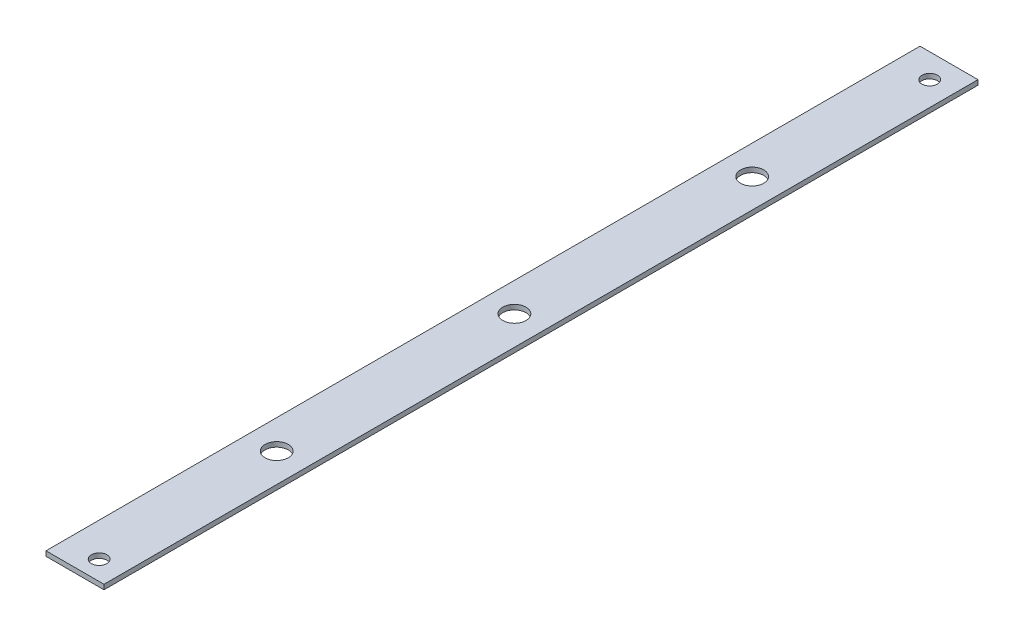
ISO-10303-21;
HEADER;
FILE_DESCRIPTION(('STEP AP214'),'2;1');
FILE_NAME('part.step','',(''),(''),'','','');
FILE_SCHEMA(('AUTOMOTIVE_DESIGN { 1 0 10303 214 1 1 1 1 }'));
ENDSEC;
DATA;
#1=APPLICATION_CONTEXT('core data for automotive mechanical design processes');
#2=APPLICATION_PROTOCOL_DEFINITION('international standard','automotive_design',2000,#1);
#3=PRODUCT_CONTEXT('',#1,'mechanical');
#4=PRODUCT('Part','Part','',(#3));
#5=PRODUCT_RELATED_PRODUCT_CATEGORY('part','',(#4));
#6=PRODUCT_DEFINITION_FORMATION('','',#4);
#7=PRODUCT_DEFINITION_CONTEXT('part definition',#1,'design');
#8=PRODUCT_DEFINITION('design','',#6,#7);
#9=PRODUCT_DEFINITION_SHAPE('','',#8);
#10=(LENGTH_UNIT() NAMED_UNIT(*) SI_UNIT(.MILLI.,.METRE.));
#11=(NAMED_UNIT(*) PLANE_ANGLE_UNIT() SI_UNIT($,.RADIAN.));
#12=(NAMED_UNIT(*) SI_UNIT($,.STERADIAN.) SOLID_ANGLE_UNIT());
#13=UNCERTAINTY_MEASURE_WITH_UNIT(LENGTH_MEASURE(1.E-05),#10,'distance_accuracy_value','');
#14=(GEOMETRIC_REPRESENTATION_CONTEXT(3) GLOBAL_UNCERTAINTY_ASSIGNED_CONTEXT((#13)) GLOBAL_UNIT_ASSIGNED_CONTEXT((#10,
#11,#12)) REPRESENTATION_CONTEXT('',''));
#15=CARTESIAN_POINT('',(0.,0.,0.));
#16=DIRECTION('',(0.,0.,1.));
#17=DIRECTION('',(1.,0.,0.));
#18=AXIS2_PLACEMENT_3D('',#15,#16,#17);
#19=CARTESIAN_POINT('',(30.,0.,226.1));
#20=DIRECTION('',(0.,1.,0.));
#21=DIRECTION('',(-1.,0.,0.));
#22=AXIS2_PLACEMENT_3D('',#19,#20,#21);
#23=PLANE('',#22);
#24=CARTESIAN_POINT('',(15.,0.,121.75));
#25=DIRECTION('',(0.,1.,0.));
#26=DIRECTION('',(-1.,0.,0.));
#27=AXIS2_PLACEMENT_3D('',#24,#25,#26);
#28=CIRCLE('',#27,6.00000000000001);
#29=CARTESIAN_POINT('',(8.99999999999999,0.,121.75));
#30=VERTEX_POINT('',#29);
#31=EDGE_CURVE('E131',#30,#30,#28,.T.);
#32=ORIENTED_EDGE('',*,*,#31,.T.);
#33=EDGE_LOOP('',(#32));
#34=FACE_BOUND('',#33,.T.);
#35=CARTESIAN_POINT('',(17.5,0.,216.1));
#36=DIRECTION('',(0.,1.,0.));
#37=DIRECTION('',(1.,0.,0.));
#38=AXIS2_PLACEMENT_3D('',#35,#36,#37);
#39=CIRCLE('',#38,4.);
#40=CARTESIAN_POINT('',(21.5,0.,216.1));
#41=VERTEX_POINT('',#40);
#42=EDGE_CURVE('E125',#41,#41,#39,.T.);
#43=ORIENTED_EDGE('',*,*,#42,.T.);
#44=EDGE_LOOP('',(#43));
#45=FACE_BOUND('',#44,.T.);
#46=CARTESIAN_POINT('',(17.5,0.,-213.6));
#47=DIRECTION('',(0.,1.,0.));
#48=DIRECTION('',(-1.,0.,0.));
#49=AXIS2_PLACEMENT_3D('',#46,#47,#48);
#50=CIRCLE('',#49,4.);
#51=CARTESIAN_POINT('',(13.5,0.,-213.6));
#52=VERTEX_POINT('',#51);
#53=EDGE_CURVE('E119',#52,#52,#50,.T.);
#54=ORIENTED_EDGE('',*,*,#53,.T.);
#55=EDGE_LOOP('',(#54));
#56=FACE_BOUND('',#55,.T.);
#57=CARTESIAN_POINT('',(15.,0.,-124.25));
#58=DIRECTION('',(0.,1.,0.));
#59=DIRECTION('',(-1.,0.,0.));
#60=AXIS2_PLACEMENT_3D('',#57,#58,#59);
#61=CIRCLE('',#60,6.);
#62=CARTESIAN_POINT('',(9.,0.,-124.25));
#63=VERTEX_POINT('',#62);
#64=EDGE_CURVE('E113',#63,#63,#61,.T.);
#65=ORIENTED_EDGE('',*,*,#64,.T.);
#66=EDGE_LOOP('',(#65));
#67=FACE_BOUND('',#66,.T.);
#68=CARTESIAN_POINT('',(15.,0.,-1.25));
#69=DIRECTION('',(0.,1.,0.));
#70=DIRECTION('',(-1.,0.,0.));
#71=AXIS2_PLACEMENT_3D('',#68,#69,#70);
#72=CIRCLE('',#71,6.);
#73=CARTESIAN_POINT('',(9.,0.,-1.25));
#74=VERTEX_POINT('',#73);
#75=EDGE_CURVE('E99',#74,#74,#72,.T.);
#76=ORIENTED_EDGE('',*,*,#75,.T.);
#77=EDGE_LOOP('',(#76));
#78=FACE_BOUND('',#77,.T.);
#79=DIRECTION('',(1.,0.,0.));
#80=VECTOR('',#79,1.);
#81=CARTESIAN_POINT('',(30.,0.,-226.1));
#82=LINE('',#81,#80);
#83=CARTESIAN_POINT('',(0.,0.,-226.1));
#84=VERTEX_POINT('',#83);
#85=CARTESIAN_POINT('',(30.,0.,-226.1));
#86=VERTEX_POINT('',#85);
#87=EDGE_CURVE('E96',#84,#86,#82,.T.);
#88=ORIENTED_EDGE('',*,*,#87,.T.);
#89=DIRECTION('',(0.,0.,-1.));
#90=VECTOR('',#89,1.);
#91=CARTESIAN_POINT('',(30.,0.,226.1));
#92=LINE('',#91,#90);
#93=CARTESIAN_POINT('',(30.,0.,226.1));
#94=VERTEX_POINT('',#93);
#95=EDGE_CURVE('E11',#94,#86,#92,.T.);
#96=ORIENTED_EDGE('',*,*,#95,.F.);
#97=DIRECTION('',(1.,0.,0.));
#98=VECTOR('',#97,1.);
#99=CARTESIAN_POINT('',(30.,0.,226.1));
#100=LINE('',#99,#98);
#101=CARTESIAN_POINT('',(0.,0.,226.1));
#102=VERTEX_POINT('',#101);
#103=EDGE_CURVE('E83',#102,#94,#100,.T.);
#104=ORIENTED_EDGE('',*,*,#103,.F.);
#105=DIRECTION('',(0.,0.,-1.));
#106=VECTOR('',#105,1.);
#107=CARTESIAN_POINT('',(0.,0.,226.1));
#108=LINE('',#107,#106);
#109=EDGE_CURVE('E92',#102,#84,#108,.T.);
#110=ORIENTED_EDGE('',*,*,#109,.T.);
#111=EDGE_LOOP('',(#88,#96,#104,#110));
#112=FACE_BOUND('',#111,.T.);
#113=ADVANCED_FACE('F33',(#34,#45,#56,#67,#78,#112),#23,.F.);
#114=CARTESIAN_POINT('',(30.,2.5,226.1));
#115=DIRECTION('',(-1.,0.,0.));
#116=DIRECTION('',(0.,0.,1.));
#117=AXIS2_PLACEMENT_3D('',#114,#115,#116);
#118=PLANE('',#117);
#119=DIRECTION('',(0.,1.,0.));
#120=VECTOR('',#119,1.);
#121=CARTESIAN_POINT('',(30.,2.5,-226.1));
#122=LINE('',#121,#120);
#123=CARTESIAN_POINT('',(30.,2.5,-226.1));
#124=VERTEX_POINT('',#123);
#125=EDGE_CURVE('E88',#86,#124,#122,.T.);
#126=ORIENTED_EDGE('',*,*,#125,.T.);
#127=DIRECTION('',(0.,0.,-1.));
#128=VECTOR('',#127,1.);
#129=CARTESIAN_POINT('',(30.,2.5,226.1));
#130=LINE('',#129,#128);
#131=CARTESIAN_POINT('',(30.,2.5,226.1));
#132=VERTEX_POINT('',#131);
#133=EDGE_CURVE('E41',#132,#124,#130,.T.);
#134=ORIENTED_EDGE('',*,*,#133,.F.);
#135=DIRECTION('',(0.,1.,0.));
#136=VECTOR('',#135,1.);
#137=CARTESIAN_POINT('',(30.,2.5,226.1));
#138=LINE('',#137,#136);
#139=EDGE_CURVE('E78',#94,#132,#138,.T.);
#140=ORIENTED_EDGE('',*,*,#139,.F.);
#141=ORIENTED_EDGE('',*,*,#95,.T.);
#142=EDGE_LOOP('',(#126,#134,#140,#141));
#143=FACE_BOUND('',#142,.T.);
#144=ADVANCED_FACE('F87',(#143),#118,.F.);
#145=CARTESIAN_POINT('',(0.,2.5,226.1));
#146=DIRECTION('',(0.,-1.,0.));
#147=DIRECTION('',(0.,0.,-1.));
#148=AXIS2_PLACEMENT_3D('',#145,#146,#147);
#149=PLANE('',#148);
#150=CARTESIAN_POINT('',(15.,2.5,121.75));
#151=DIRECTION('',(0.,1.,0.));
#152=DIRECTION('',(-1.,0.,0.));
#153=AXIS2_PLACEMENT_3D('',#150,#151,#152);
#154=CIRCLE('',#153,6.00000000000001);
#155=CARTESIAN_POINT('',(8.99999999999999,2.5,121.75));
#156=VERTEX_POINT('',#155);
#157=EDGE_CURVE('E134',#156,#156,#154,.T.);
#158=ORIENTED_EDGE('',*,*,#157,.F.);
#159=EDGE_LOOP('',(#158));
#160=FACE_BOUND('',#159,.T.);
#161=CARTESIAN_POINT('',(17.5,2.5,216.1));
#162=DIRECTION('',(0.,1.,0.));
#163=DIRECTION('',(1.,0.,0.));
#164=AXIS2_PLACEMENT_3D('',#161,#162,#163);
#165=CIRCLE('',#164,4.);
#166=CARTESIAN_POINT('',(21.5,2.5,216.1));
#167=VERTEX_POINT('',#166);
#168=EDGE_CURVE('E128',#167,#167,#165,.T.);
#169=ORIENTED_EDGE('',*,*,#168,.F.);
#170=EDGE_LOOP('',(#169));
#171=FACE_BOUND('',#170,.T.);
#172=CARTESIAN_POINT('',(17.5,2.5,-213.6));
#173=DIRECTION('',(0.,1.,0.));
#174=DIRECTION('',(-1.,0.,0.));
#175=AXIS2_PLACEMENT_3D('',#172,#173,#174);
#176=CIRCLE('',#175,4.);
#177=CARTESIAN_POINT('',(13.5,2.5,-213.6));
#178=VERTEX_POINT('',#177);
#179=EDGE_CURVE('E122',#178,#178,#176,.T.);
#180=ORIENTED_EDGE('',*,*,#179,.F.);
#181=EDGE_LOOP('',(#180));
#182=FACE_BOUND('',#181,.T.);
#183=CARTESIAN_POINT('',(15.,2.5,-124.25));
#184=DIRECTION('',(0.,1.,0.));
#185=DIRECTION('',(-1.,0.,0.));
#186=AXIS2_PLACEMENT_3D('',#183,#184,#185);
#187=CIRCLE('',#186,6.);
#188=CARTESIAN_POINT('',(9.,2.5,-124.25));
#189=VERTEX_POINT('',#188);
#190=EDGE_CURVE('E116',#189,#189,#187,.T.);
#191=ORIENTED_EDGE('',*,*,#190,.F.);
#192=EDGE_LOOP('',(#191));
#193=FACE_BOUND('',#192,.T.);
#194=CARTESIAN_POINT('',(15.,2.5,-1.25));
#195=DIRECTION('',(0.,1.,0.));
#196=DIRECTION('',(-1.,0.,0.));
#197=AXIS2_PLACEMENT_3D('',#194,#195,#196);
#198=CIRCLE('',#197,6.);
#199=CARTESIAN_POINT('',(9.,2.5,-1.25));
#200=VERTEX_POINT('',#199);
#201=EDGE_CURVE('E110',#200,#200,#198,.T.);
#202=ORIENTED_EDGE('',*,*,#201,.F.);
#203=EDGE_LOOP('',(#202));
#204=FACE_BOUND('',#203,.T.);
#205=DIRECTION('',(-1.,0.,0.));
#206=VECTOR('',#205,1.);
#207=CARTESIAN_POINT('',(0.,2.5,-226.1));
#208=LINE('',#207,#206);
#209=CARTESIAN_POINT('',(0.,2.5,-226.1));
#210=VERTEX_POINT('',#209);
#211=EDGE_CURVE('E65',#124,#210,#208,.T.);
#212=ORIENTED_EDGE('',*,*,#211,.T.);
#213=DIRECTION('',(0.,0.,-1.));
#214=VECTOR('',#213,1.);
#215=CARTESIAN_POINT('',(0.,2.5,226.1));
#216=LINE('',#215,#214);
#217=CARTESIAN_POINT('',(0.,2.5,226.1));
#218=VERTEX_POINT('',#217);
#219=EDGE_CURVE('E89',#218,#210,#216,.T.);
#220=ORIENTED_EDGE('',*,*,#219,.F.);
#221=DIRECTION('',(-1.,0.,0.));
#222=VECTOR('',#221,1.);
#223=CARTESIAN_POINT('',(2.5,2.5,226.1));
#224=LINE('',#223,#222);
#225=EDGE_CURVE('E81',#132,#218,#224,.T.);
#226=ORIENTED_EDGE('',*,*,#225,.F.);
#227=ORIENTED_EDGE('',*,*,#133,.T.);
#228=EDGE_LOOP('',(#212,#220,#226,#227));
#229=FACE_BOUND('',#228,.T.);
#230=ADVANCED_FACE('F90',(#160,#171,#182,#193,#204,#229),#149,.F.);
#231=CARTESIAN_POINT('',(0.,0.,226.1));
#232=DIRECTION('',(1.,0.,0.));
#233=DIRECTION('',(0.,0.,-1.));
#234=AXIS2_PLACEMENT_3D('',#231,#232,#233);
#235=PLANE('',#234);
#236=DIRECTION('',(0.,-1.,0.));
#237=VECTOR('',#236,1.);
#238=CARTESIAN_POINT('',(0.,0.,-226.1));
#239=LINE('',#238,#237);
#240=EDGE_CURVE('E71',#210,#84,#239,.T.);
#241=ORIENTED_EDGE('',*,*,#240,.T.);
#242=ORIENTED_EDGE('',*,*,#109,.F.);
#243=DIRECTION('',(0.,-1.,0.));
#244=VECTOR('',#243,1.);
#245=CARTESIAN_POINT('',(0.,0.,226.1));
#246=LINE('',#245,#244);
#247=EDGE_CURVE('E49',#218,#102,#246,.T.);
#248=ORIENTED_EDGE('',*,*,#247,.F.);
#249=ORIENTED_EDGE('',*,*,#219,.T.);
#250=EDGE_LOOP('',(#241,#242,#248,#249));
#251=FACE_BOUND('',#250,.T.);
#252=ADVANCED_FACE('F104',(#251),#235,.F.);
#253=CARTESIAN_POINT('',(0.,0.,226.1));
#254=DIRECTION('',(0.,0.,-1.));
#255=DIRECTION('',(-1.,0.,0.));
#256=AXIS2_PLACEMENT_3D('',#253,#254,#255);
#257=PLANE('',#256);
#258=ORIENTED_EDGE('',*,*,#103,.T.);
#259=ORIENTED_EDGE('',*,*,#139,.T.);
#260=ORIENTED_EDGE('',*,*,#225,.T.);
#261=ORIENTED_EDGE('',*,*,#247,.T.);
#262=EDGE_LOOP('',(#258,#259,#260,#261));
#263=FACE_BOUND('',#262,.T.);
#264=ADVANCED_FACE('F79',(#263),#257,.F.);
#265=CARTESIAN_POINT('',(0.,0.,-226.1));
#266=DIRECTION('',(0.,0.,-1.));
#267=DIRECTION('',(-1.,0.,0.));
#268=AXIS2_PLACEMENT_3D('',#265,#266,#267);
#269=PLANE('',#268);
#270=ORIENTED_EDGE('',*,*,#87,.F.);
#271=ORIENTED_EDGE('',*,*,#240,.F.);
#272=ORIENTED_EDGE('',*,*,#211,.F.);
#273=ORIENTED_EDGE('',*,*,#125,.F.);
#274=EDGE_LOOP('',(#270,#271,#272,#273));
#275=FACE_BOUND('',#274,.T.);
#276=ADVANCED_FACE('F107',(#275),#269,.T.);
#277=CARTESIAN_POINT('',(15.,0.,-1.25));
#278=DIRECTION('',(0.,1.,0.));
#279=DIRECTION('',(-1.,0.,0.));
#280=AXIS2_PLACEMENT_3D('',#277,#278,#279);
#281=CYLINDRICAL_SURFACE('',#280,6.);
#282=ORIENTED_EDGE('',*,*,#75,.F.);
#283=EDGE_LOOP('',(#282));
#284=FACE_BOUND('',#283,.T.);
#285=ORIENTED_EDGE('',*,*,#201,.T.);
#286=EDGE_LOOP('',(#285));
#287=FACE_BOUND('',#286,.T.);
#288=ADVANCED_FACE('F160',(#284,#287),#281,.F.);
#289=CARTESIAN_POINT('',(15.,0.,-124.25));
#290=DIRECTION('',(0.,1.,0.));
#291=DIRECTION('',(-1.,0.,0.));
#292=AXIS2_PLACEMENT_3D('',#289,#290,#291);
#293=CYLINDRICAL_SURFACE('',#292,6.);
#294=ORIENTED_EDGE('',*,*,#64,.F.);
#295=EDGE_LOOP('',(#294));
#296=FACE_BOUND('',#295,.T.);
#297=ORIENTED_EDGE('',*,*,#190,.T.);
#298=EDGE_LOOP('',(#297));
#299=FACE_BOUND('',#298,.T.);
#300=ADVANCED_FACE('F162',(#296,#299),#293,.F.);
#301=CARTESIAN_POINT('',(17.5,0.,-213.6));
#302=DIRECTION('',(0.,1.,0.));
#303=DIRECTION('',(-1.,0.,0.));
#304=AXIS2_PLACEMENT_3D('',#301,#302,#303);
#305=CYLINDRICAL_SURFACE('',#304,4.);
#306=ORIENTED_EDGE('',*,*,#53,.F.);
#307=EDGE_LOOP('',(#306));
#308=FACE_BOUND('',#307,.T.);
#309=ORIENTED_EDGE('',*,*,#179,.T.);
#310=EDGE_LOOP('',(#309));
#311=FACE_BOUND('',#310,.T.);
#312=ADVANCED_FACE('F169',(#308,#311),#305,.F.);
#313=CARTESIAN_POINT('',(17.5,0.,216.1));
#314=DIRECTION('',(0.,1.,0.));
#315=DIRECTION('',(-1.,0.,0.));
#316=AXIS2_PLACEMENT_3D('',#313,#314,#315);
#317=CYLINDRICAL_SURFACE('',#316,4.);
#318=ORIENTED_EDGE('',*,*,#42,.F.);
#319=EDGE_LOOP('',(#318));
#320=FACE_BOUND('',#319,.T.);
#321=ORIENTED_EDGE('',*,*,#168,.T.);
#322=EDGE_LOOP('',(#321));
#323=FACE_BOUND('',#322,.T.);
#324=ADVANCED_FACE('F145',(#320,#323),#317,.F.);
#325=CARTESIAN_POINT('',(15.,0.,121.75));
#326=DIRECTION('',(0.,1.,0.));
#327=DIRECTION('',(-1.,0.,0.));
#328=AXIS2_PLACEMENT_3D('',#325,#326,#327);
#329=CYLINDRICAL_SURFACE('',#328,6.00000000000001);
#330=ORIENTED_EDGE('',*,*,#31,.F.);
#331=EDGE_LOOP('',(#330));
#332=FACE_BOUND('',#331,.T.);
#333=ORIENTED_EDGE('',*,*,#157,.T.);
#334=EDGE_LOOP('',(#333));
#335=FACE_BOUND('',#334,.T.);
#336=ADVANCED_FACE('F142',(#332,#335),#329,.F.);
#337=CLOSED_SHELL('',(#113,#144,#230,#252,#264,#276,#288,#300,#312,#324,#336));
#338=MANIFOLD_SOLID_BREP('B2',#337);
#339=ADVANCED_BREP_SHAPE_REPRESENTATION('',(#18,#338),#14);
#340=SHAPE_DEFINITION_REPRESENTATION(#9,#339);
ENDSEC;
END-ISO-10303-21;
